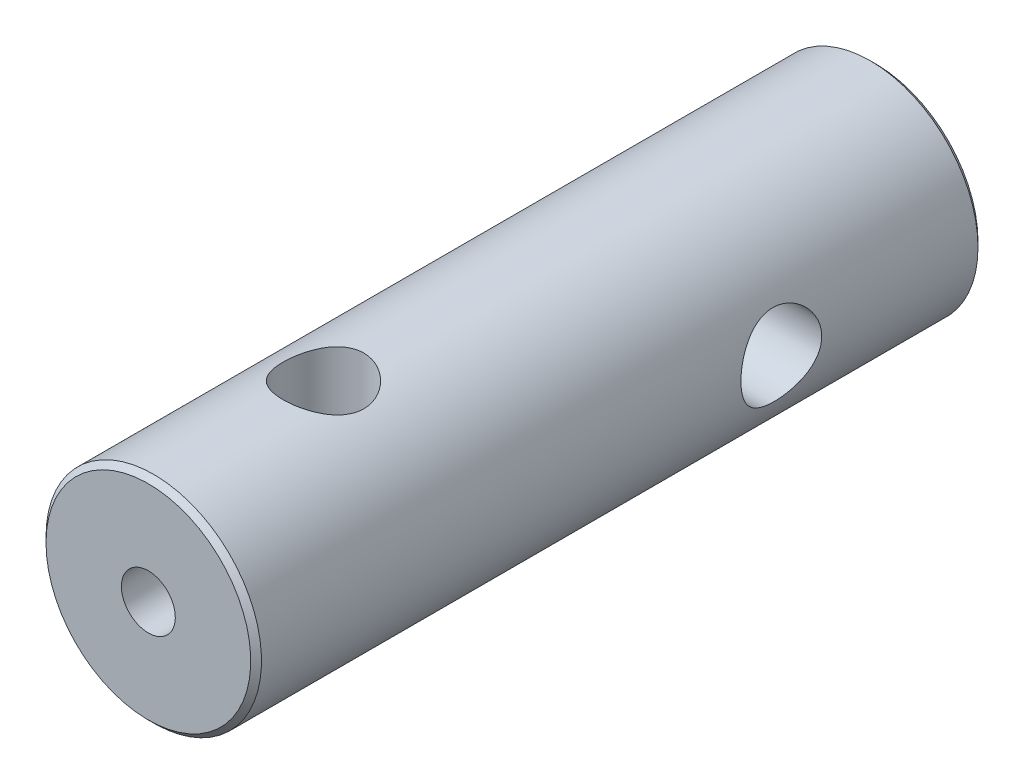
ISO-10303-21;
HEADER;
FILE_DESCRIPTION(('STEP AP214'),'2;1');
FILE_NAME('part.step','',(''),(''),'','','');
FILE_SCHEMA(('AUTOMOTIVE_DESIGN { 1 0 10303 214 1 1 1 1 }'));
ENDSEC;
DATA;
#1=APPLICATION_CONTEXT('core data for automotive mechanical design processes');
#2=APPLICATION_PROTOCOL_DEFINITION('international standard','automotive_design',2000,#1);
#3=PRODUCT_CONTEXT('',#1,'mechanical');
#4=PRODUCT('Part','Part','',(#3));
#5=PRODUCT_RELATED_PRODUCT_CATEGORY('part','',(#4));
#6=PRODUCT_DEFINITION_FORMATION('','',#4);
#7=PRODUCT_DEFINITION_CONTEXT('part definition',#1,'design');
#8=PRODUCT_DEFINITION('design','',#6,#7);
#9=PRODUCT_DEFINITION_SHAPE('','',#8);
#10=(LENGTH_UNIT() NAMED_UNIT(*) SI_UNIT(.MILLI.,.METRE.));
#11=(NAMED_UNIT(*) PLANE_ANGLE_UNIT() SI_UNIT($,.RADIAN.));
#12=(NAMED_UNIT(*) SI_UNIT($,.STERADIAN.) SOLID_ANGLE_UNIT());
#13=UNCERTAINTY_MEASURE_WITH_UNIT(LENGTH_MEASURE(1.E-05),#10,'distance_accuracy_value','');
#14=(GEOMETRIC_REPRESENTATION_CONTEXT(3) GLOBAL_UNCERTAINTY_ASSIGNED_CONTEXT((#13)) GLOBAL_UNIT_ASSIGNED_CONTEXT((#10,
#11,#12)) REPRESENTATION_CONTEXT('',''));
#15=CARTESIAN_POINT('',(0.,0.,0.));
#16=DIRECTION('',(0.,0.,1.));
#17=DIRECTION('',(1.,0.,0.));
#18=AXIS2_PLACEMENT_3D('',#15,#16,#17);
#19=CARTESIAN_POINT('',(0.,667.33201228622,-372.857743681072));
#20=DIRECTION('',(0.,0.,1.));
#21=DIRECTION('',(1.,0.,0.));
#22=AXIS2_PLACEMENT_3D('',#19,#20,#21);
#23=PLANE('',#22);
#24=CARTESIAN_POINT('',(0.,667.33201228622,-372.857743681072));
#25=DIRECTION('',(0.,0.,-1.));
#26=DIRECTION('',(0.,1.,0.));
#27=AXIS2_PLACEMENT_3D('',#24,#25,#26);
#28=CIRCLE('',#27,1.);
#29=CARTESIAN_POINT('',(0.,668.33201228622,-372.857743681072));
#30=VERTEX_POINT('',#29);
#31=EDGE_CURVE('E18',#30,#30,#28,.T.);
#32=ORIENTED_EDGE('',*,*,#31,.T.);
#33=EDGE_LOOP('',(#32));
#34=FACE_BOUND('',#33,.T.);
#35=CARTESIAN_POINT('',(0.,667.33201228622,-372.857743680925));
#36=DIRECTION('',(0.,0.,-1.));
#37=DIRECTION('',(-1.,0.,0.));
#38=AXIS2_PLACEMENT_3D('',#35,#36,#37);
#39=CIRCLE('',#38,3.80000000010827);
#40=CARTESIAN_POINT('',(-3.80000000010827,667.33201228622,-372.857743680925));
#41=VERTEX_POINT('',#40);
#42=EDGE_CURVE('E71',#41,#41,#39,.T.);
#43=ORIENTED_EDGE('',*,*,#42,.F.);
#44=EDGE_LOOP('',(#43));
#45=FACE_BOUND('',#44,.T.);
#46=ADVANCED_FACE('F15',(#34,#45),#23,.T.);
#47=CARTESIAN_POINT('',(0.,667.33201228622,-375.107743681072));
#48=DIRECTION('',(0.,0.,-1.));
#49=DIRECTION('',(0.,1.,0.));
#50=AXIS2_PLACEMENT_3D('',#47,#48,#49);
#51=CYLINDRICAL_SURFACE('',#50,1.);
#52=ORIENTED_EDGE('',*,*,#31,.F.);
#53=EDGE_LOOP('',(#52));
#54=FACE_BOUND('',#53,.T.);
#55=CARTESIAN_POINT('',(-1.,667.33201228622,-378.239709692321));
#56=CARTESIAN_POINT('',(-0.999992478924149,667.380747378736,-378.239697318764));
#57=CARTESIAN_POINT('',(-0.996399813993387,667.429565307739,-378.236456892599));
#58=CARTESIAN_POINT('',(-0.982310251669483,667.525503242356,-378.224101110688));
#59=CARTESIAN_POINT('',(-0.971789403236803,667.572616757524,-378.214965376808));
#60=CARTESIAN_POINT('',(-0.944676497496951,667.663385662361,-378.19245817535));
#61=CARTESIAN_POINT('',(-0.928147448411199,667.707071418175,-378.179130853804));
#62=CARTESIAN_POINT('',(-0.889662091659111,667.790960633344,-378.149817492051));
#63=CARTESIAN_POINT('',(-0.867706638554931,667.831164639668,-378.133831870609));
#64=CARTESIAN_POINT('',(-0.815013090372891,667.913833815842,-378.098013998009));
#65=CARTESIAN_POINT('',(-0.783439550678679,667.95567512472,-378.07797049909));
#66=CARTESIAN_POINT('',(-0.714098949741552,668.034010959446,-378.038021056078));
#67=CARTESIAN_POINT('',(-0.67632539829245,668.07049980569,-378.018115279154));
#68=CARTESIAN_POINT('',(-0.589078199073816,668.142334300967,-377.977299466836));
#69=CARTESIAN_POINT('',(-0.538702678853991,668.176753905246,-377.956659529814));
#70=CARTESIAN_POINT('',(-0.431234872880395,668.236333608755,-377.919951087639));
#71=CARTESIAN_POINT('',(-0.374150258400653,668.261504150132,-377.903877431858));
#72=CARTESIAN_POINT('',(-0.26162450355075,668.298790496302,-377.879744136549));
#73=CARTESIAN_POINT('',(-0.206717293255859,668.31205397479,-377.870987791986));
#74=CARTESIAN_POINT('',(-0.0948476523195606,668.329104536111,-377.859694950476));
#75=CARTESIAN_POINT('',(-0.0378879047001586,668.33290356515,-377.857150612697));
#76=CARTESIAN_POINT('',(0.0670734653959218,668.330926062375,-377.85846687172));
#77=CARTESIAN_POINT('',(0.115120199818957,668.326517771828,-377.861412349211));
#78=CARTESIAN_POINT('',(0.209619201295724,668.310966787864,-377.871702748896));
#79=CARTESIAN_POINT('',(0.256071347844395,668.299823586661,-377.879048002816));
#80=CARTESIAN_POINT('',(0.346038922439846,668.271414459553,-377.897483213266));
#81=CARTESIAN_POINT('',(0.389565222007163,668.254172883215,-377.908558269163));
#82=CARTESIAN_POINT('',(0.473104491149039,668.214235508389,-377.933638128428));
#83=CARTESIAN_POINT('',(0.51311681024609,668.19153870297,-377.947643472609));
#84=CARTESIAN_POINT('',(0.594143147155235,668.138022273653,-377.979653787795));
#85=CARTESIAN_POINT('',(0.634597629879143,668.106527123889,-377.997942504336));
#86=CARTESIAN_POINT('',(0.709995653793869,668.038061163122,-378.035741562724));
#87=CARTESIAN_POINT('',(0.744930781166684,668.00108215563,-378.055253707537));
#88=CARTESIAN_POINT('',(0.813854394700609,667.91603936934,-378.096989397655));
#89=CARTESIAN_POINT('',(0.846855925180306,667.867145901118,-378.119164172855));
#90=CARTESIAN_POINT('',(0.904165186008948,667.763276674577,-378.160358275152));
#91=CARTESIAN_POINT('',(0.928484325431816,667.708309023404,-378.179381725479));
#92=CARTESIAN_POINT('',(0.961768413970198,667.609345436805,-378.206515198472));
#93=CARTESIAN_POINT('',(0.973125714602644,667.566584592171,-378.216189511989));
#94=CARTESIAN_POINT('',(0.990093986914226,667.479236405063,-378.230869240515));
#95=CARTESIAN_POINT('',(0.995725376111317,667.434656146186,-378.235891239062));
#96=CARTESIAN_POINT('',(0.999444056465946,667.370586876566,-378.239213557707));
#97=CARTESIAN_POINT('',(1.00000297752657,667.351306072862,-378.239714590903));
#98=CARTESIAN_POINT('',(0.999992478924158,667.283277193704,-378.239697318765));
#99=CARTESIAN_POINT('',(0.996399813993387,667.234459264701,-378.2364568926));
#100=CARTESIAN_POINT('',(0.982310251669492,667.138521330084,-378.22410111069));
#101=CARTESIAN_POINT('',(0.971789403236837,667.091407814916,-378.21496537681));
#102=CARTESIAN_POINT('',(0.944676497497062,667.000638910079,-378.192458175352));
#103=CARTESIAN_POINT('',(0.928147448411366,666.956953154265,-378.179130853806));
#104=CARTESIAN_POINT('',(0.889662091659374,666.873063939096,-378.149817492053));
#105=CARTESIAN_POINT('',(0.867706638555214,666.832859932773,-378.13383187061));
#106=CARTESIAN_POINT('',(0.815013090373199,666.750190756598,-378.09801399801));
#107=CARTESIAN_POINT('',(0.783439550678989,666.708349447721,-378.077970499091));
#108=CARTESIAN_POINT('',(0.714098949741917,666.630013612994,-378.038021056079));
#109=CARTESIAN_POINT('',(0.676325398292865,666.59352476675,-378.018115279155));
#110=CARTESIAN_POINT('',(0.589078199074292,666.521690271474,-377.977299466837));
#111=CARTESIAN_POINT('',(0.538702678854473,666.487270667194,-377.956659529815));
#112=CARTESIAN_POINT('',(0.431234872880901,666.427690963685,-377.919951087639));
#113=CARTESIAN_POINT('',(0.374150258401177,666.402520422308,-377.903877431859));
#114=CARTESIAN_POINT('',(0.261624503551243,666.365234076138,-377.87974413655));
#115=CARTESIAN_POINT('',(0.206717293256305,666.35197059765,-377.870987791987));
#116=CARTESIAN_POINT('',(0.0948476523199132,666.334920036329,-377.859694950476));
#117=CARTESIAN_POINT('',(0.0378879047004664,666.33112100729,-377.857150612698));
#118=CARTESIAN_POINT('',(-0.0670734653956755,666.333098510065,-377.85846687172));
#119=CARTESIAN_POINT('',(-0.115120199818726,666.337506800612,-377.861412349211));
#120=CARTESIAN_POINT('',(-0.209619201295545,666.353057784576,-377.871702748896));
#121=CARTESIAN_POINT('',(-0.256071347844251,666.364200985779,-377.879048002815));
#122=CARTESIAN_POINT('',(-0.34603892243973,666.392610112887,-377.897483213265));
#123=CARTESIAN_POINT('',(-0.389565222007041,666.409851689225,-377.908558269162));
#124=CARTESIAN_POINT('',(-0.473104491148921,666.449789064051,-377.933638128427));
#125=CARTESIAN_POINT('',(-0.513116810245982,666.47248586947,-377.947643472608));
#126=CARTESIAN_POINT('',(-0.594143147155156,666.526002298787,-377.979653787794));
#127=CARTESIAN_POINT('',(-0.63459762987908,666.557497448551,-377.997942504335));
#128=CARTESIAN_POINT('',(-0.709995653793772,666.625963409318,-378.035741562723));
#129=CARTESIAN_POINT('',(-0.744930781166539,666.66294241681,-378.055253707536));
#130=CARTESIAN_POINT('',(-0.813854394700442,666.7479852031,-378.096989397654));
#131=CARTESIAN_POINT('',(-0.846855925180174,666.796878671322,-378.119164172853));
#132=CARTESIAN_POINT('',(-0.904165186008825,666.900747897863,-378.16035827515));
#133=CARTESIAN_POINT('',(-0.92848432543167,666.955715549035,-378.179381725477));
#134=CARTESIAN_POINT('',(-0.961768413970081,667.054679135634,-378.206515198471));
#135=CARTESIAN_POINT('',(-0.973125714602556,667.097439980268,-378.216189511988));
#136=CARTESIAN_POINT('',(-0.990093986914186,667.184788167376,-378.230869240513));
#137=CARTESIAN_POINT('',(-0.995725376111295,667.229368426254,-378.23589123906));
#138=CARTESIAN_POINT('',(-0.999444056465939,667.293437695874,-378.239213557705));
#139=CARTESIAN_POINT('',(-1.00000297752657,667.312718499577,-378.239714590902));
#140=CARTESIAN_POINT('',(-1.,667.33201228622,-378.239709692321));
#141=B_SPLINE_CURVE_WITH_KNOTS('',3,(#55,#56,#57,#58,#59,#60,#61,#62,#63,#64,#65,#66,#67,#68,
#69,#70,#71,#72,#73,#74,#75,#76,#77,#78,#79,#80,#81,#82,#83,#84,#85,#86,#87,#88,#89,#90,#91,#92,
#93,#94,#95,#96,#97,#98,#99,#100,#101,#102,#103,#104,#105,#106,#107,#108,#109,#110,#111,#112,
#113,#114,#115,#116,#117,#118,#119,#120,#121,#122,#123,#124,#125,#126,#127,#128,#129,#130,#131,
#132,#133,#134,#135,#136,#137,#138,#139,#140),.UNSPECIFIED.,.T.,.F.,(4,2,2,2,2,2,2,2,2,2,2,2,2,
2,2,2,2,2,2,2,2,2,2,2,2,2,2,2,2,2,2,2,2,2,2,2,2,2,2,2,2,2,4),(0.,0.14613086545061,
0.292769582718843,0.437912881300494,0.583033336941249,0.750767130901795,0.918677642639682,
1.1108362291228,1.30277719804278,1.47318756851124,1.64338273457219,1.7876975475012,
1.93202324258413,2.07577906166235,2.21956143572323,2.382241455931,2.54516712458717,
2.7333588566898,2.92130237775347,3.05664347079668,3.19150025248628,3.24935215333123,
3.39548301878179,3.54212173604979,3.68726503463108,3.83238549027197,4.00011928423252,
4.16802979597049,4.36018838245372,4.55212935137378,4.7225397218424,4.89273488790351,
5.03704970083257,5.18137539591557,5.32513121499375,5.46891358905454,5.63159360926226,
5.79451927791829,5.98271101002078,6.17065453108418,6.30599562412751,6.44085240581723,
6.49870430666243),.UNSPECIFIED.);
#142=CARTESIAN_POINT('',(-1.,667.33201228622,-378.239709692321));
#143=VERTEX_POINT('',#142);
#144=EDGE_CURVE('E66',#143,#143,#141,.T.);
#145=ORIENTED_EDGE('',*,*,#144,.T.);
#146=EDGE_LOOP('',(#145));
#147=FACE_BOUND('',#146,.T.);
#148=ADVANCED_FACE('F72',(#54,#147),#51,.F.);
#149=CARTESIAN_POINT('',(0.,667.33201228622,-399.857743681072));
#150=DIRECTION('',(0.,0.,1.));
#151=DIRECTION('',(1.,0.,0.));
#152=AXIS2_PLACEMENT_3D('',#149,#150,#151);
#153=PLANE('',#152);
#154=CARTESIAN_POINT('',(0.,667.33201228622,-399.857743681196));
#155=DIRECTION('',(0.,0.,1.));
#156=DIRECTION('',(1.,0.,0.));
#157=AXIS2_PLACEMENT_3D('',#154,#155,#156);
#158=CIRCLE('',#157,3.80000000008718);
#159=CARTESIAN_POINT('',(3.80000000008718,667.33201228622,-399.857743681196));
#160=VERTEX_POINT('',#159);
#161=EDGE_CURVE('E63',#160,#160,#158,.T.);
#162=ORIENTED_EDGE('',*,*,#161,.F.);
#163=EDGE_LOOP('',(#162));
#164=FACE_BOUND('',#163,.T.);
#165=ADVANCED_FACE('F85',(#164),#153,.F.);
#166=CARTESIAN_POINT('',(0.,667.33201228622,-373.057743681159));
#167=DIRECTION('',(0.,0.,-1.));
#168=DIRECTION('',(-1.,0.,0.));
#169=AXIS2_PLACEMENT_3D('',#166,#167,#168);
#170=CONICAL_SURFACE('',#169,3.99999999994438,0.785398162402688);
#171=CARTESIAN_POINT('',(0.,667.33201228622,-373.057743681072));
#172=DIRECTION('',(0.,0.,-1.));
#173=DIRECTION('',(-1.,0.,0.));
#174=AXIS2_PLACEMENT_3D('',#171,#172,#173);
#175=CIRCLE('',#174,4.);
#176=CARTESIAN_POINT('',(-3.99999999999999,667.33201228622,-373.057743681072));
#177=VERTEX_POINT('',#176);
#178=EDGE_CURVE('E36',#177,#177,#175,.T.);
#179=ORIENTED_EDGE('',*,*,#178,.F.);
#180=EDGE_LOOP('',(#179));
#181=FACE_BOUND('',#180,.T.);
#182=ORIENTED_EDGE('',*,*,#42,.T.);
#183=EDGE_LOOP('',(#182));
#184=FACE_BOUND('',#183,.T.);
#185=ADVANCED_FACE('F80',(#181,#184),#170,.T.);
#186=CARTESIAN_POINT('',(-9.094947E-13,667.332012286217,-379.357743681072));
#187=DIRECTION('',(0.,-1.,0.));
#188=DIRECTION('',(0.,0.,-1.));
#189=AXIS2_PLACEMENT_3D('',#186,#187,#188);
#190=CYLINDRICAL_SURFACE('',#189,1.5);
#191=CARTESIAN_POINT('',(-2.21356575496999E-13,671.33201228622,-377.857743681072));
#192=CARTESIAN_POINT('',(-0.0811637797182568,671.332009750952,-377.857746941328));
#193=CARTESIAN_POINT('',(-0.162363908439502,671.329517241132,-377.864358714796));
#194=CARTESIAN_POINT('',(-0.322386831218151,671.319807372418,-377.890551552126));
#195=CARTESIAN_POINT('',(-0.401207649668353,671.312586194259,-377.910143099681));
#196=CARTESIAN_POINT('',(-0.554065647957708,671.294199418451,-377.961499513184));
#197=CARTESIAN_POINT('',(-0.62811343638519,671.283042952026,-377.993236212549));
#198=CARTESIAN_POINT('',(-0.769812559913221,671.257897445169,-378.067858015635));
#199=CARTESIAN_POINT('',(-0.837463368371388,671.243908171818,-378.110744036154));
#200=CARTESIAN_POINT('',(-0.967340405524647,671.213876072696,-378.208351732447));
#201=CARTESIAN_POINT('',(-1.02925973068664,671.197775125311,-378.263463728823));
#202=CARTESIAN_POINT('',(-1.14323515279412,671.165617342721,-378.383143263679));
#203=CARTESIAN_POINT('',(-1.19528649107164,671.14956053246,-378.447715337648));
#204=CARTESIAN_POINT('',(-1.29000339800975,671.118629876676,-378.587491016599));
#205=CARTESIAN_POINT('',(-1.33223093134234,671.103825290632,-378.663008024908));
#206=CARTESIAN_POINT('',(-1.40321326562938,671.078001155179,-378.820673714844));
#207=CARTESIAN_POINT('',(-1.4319854345712,671.066976731325,-378.902813686094));
#208=CARTESIAN_POINT('',(-1.46885948096208,671.052592568057,-379.047362990244));
#209=CARTESIAN_POINT('',(-1.48050950764863,671.047945751861,-379.10876044862));
#210=CARTESIAN_POINT('',(-1.49608055228063,671.041704155795,-379.232679302283));
#211=CARTESIAN_POINT('',(-1.50000264542476,671.04010895135,-379.295200539995));
#212=CARTESIAN_POINT('',(-1.49999657652745,671.040114866527,-379.438681480001));
#213=CARTESIAN_POINT('',(-1.49342029679365,671.042794049564,-379.519655961034));
#214=CARTESIAN_POINT('',(-1.4673813199887,671.053165248769,-379.679208899218));
#215=CARTESIAN_POINT('',(-1.44790729939155,671.060861669709,-379.757785187414));
#216=CARTESIAN_POINT('',(-1.39689388750466,671.080268375327,-379.910123430543));
#217=CARTESIAN_POINT('',(-1.36538785775593,671.09196755218,-379.983898043079));
#218=CARTESIAN_POINT('',(-1.29131120222963,671.118046027888,-380.125128018151));
#219=CARTESIAN_POINT('',(-1.24873918346762,671.132425664095,-380.192582583664));
#220=CARTESIAN_POINT('',(-1.15147101765925,671.163046712428,-380.322628041889));
#221=CARTESIAN_POINT('',(-1.09631386593323,671.179342896646,-380.384861323394));
#222=CARTESIAN_POINT('',(-0.97640657045064,671.211507025864,-380.499457519922));
#223=CARTESIAN_POINT('',(-0.911652733558161,671.227374803207,-380.551816617311));
#224=CARTESIAN_POINT('',(-0.771665499721755,671.257547751026,-380.64690408349));
#225=CARTESIAN_POINT('',(-0.696148297553631,671.271780418964,-380.689239337299));
#226=CARTESIAN_POINT('',(-0.538476246683239,671.2964014335,-380.760421076508));
#227=CARTESIAN_POINT('',(-0.456329605955194,671.306794447671,-380.789283950573));
#228=CARTESIAN_POINT('',(-0.311553638319177,671.320326642251,-380.826366188855));
#229=CARTESIAN_POINT('',(-0.249917625399308,671.324683044206,-380.838105889297));
#230=CARTESIAN_POINT('',(-0.125528244784168,671.330526696843,-380.853795489547));
#231=CARTESIAN_POINT('',(-0.0627749944400534,671.332014247087,-380.857746202672));
#232=CARTESIAN_POINT('',(0.0811637797174864,671.332009750952,-380.857740420816));
#233=CARTESIAN_POINT('',(0.16236390843873,671.329517241132,-380.851128647348));
#234=CARTESIAN_POINT('',(0.322386831217359,671.319807372418,-380.824935810018));
#235=CARTESIAN_POINT('',(0.401207649667544,671.312586194259,-380.805344262462));
#236=CARTESIAN_POINT('',(0.554065647956855,671.294199418451,-380.75398784896));
#237=CARTESIAN_POINT('',(0.628113436384313,671.283042952026,-380.722251149594));
#238=CARTESIAN_POINT('',(0.769812559912305,671.257897445169,-380.647629346508));
#239=CARTESIAN_POINT('',(0.837463368370457,671.243908171818,-380.604743325989));
#240=CARTESIAN_POINT('',(0.967340405523673,671.213876072696,-380.507135629696));
#241=CARTESIAN_POINT('',(1.02925973068565,671.197775125312,-380.45202363332));
#242=CARTESIAN_POINT('',(1.14323515279304,671.165617342722,-380.332344098464));
#243=CARTESIAN_POINT('',(1.19528649107052,671.14956053246,-380.267772024495));
#244=CARTESIAN_POINT('',(1.29000339800851,671.118629876676,-380.127996345544));
#245=CARTESIAN_POINT('',(1.33223093134103,671.103825290633,-380.052479337236));
#246=CARTESIAN_POINT('',(1.40321326562795,671.078001155179,-379.894813647299));
#247=CARTESIAN_POINT('',(1.43198543456972,671.066976731326,-379.812673676049));
#248=CARTESIAN_POINT('',(1.46885948096045,671.052592568057,-379.668124371899));
#249=CARTESIAN_POINT('',(1.48050950764693,671.047945751862,-379.606726913523));
#250=CARTESIAN_POINT('',(1.49608055227884,671.041704155796,-379.482808059861));
#251=CARTESIAN_POINT('',(1.50000264542294,671.040108951351,-379.420286822149));
#252=CARTESIAN_POINT('',(1.49999657652564,671.040114866528,-379.276805882143));
#253=CARTESIAN_POINT('',(1.49342029679184,671.042794049565,-379.195831401109));
#254=CARTESIAN_POINT('',(1.46738131998687,671.05316524877,-379.036278462926));
#255=CARTESIAN_POINT('',(1.44790729938971,671.060861669709,-378.95770217473));
#256=CARTESIAN_POINT('',(1.39689388750282,671.080268375328,-378.805363931601));
#257=CARTESIAN_POINT('',(1.36538785775408,671.091967552181,-378.731589319065));
#258=CARTESIAN_POINT('',(1.29131120222776,671.118046027889,-378.590359343993));
#259=CARTESIAN_POINT('',(1.24873918346573,671.132425664095,-378.522904778479));
#260=CARTESIAN_POINT('',(1.15147101765735,671.163046712429,-378.392859320255));
#261=CARTESIAN_POINT('',(1.09631386593133,671.179342896647,-378.33062603875));
#262=CARTESIAN_POINT('',(0.976406570448718,671.211507025865,-378.216029842222));
#263=CARTESIAN_POINT('',(0.911652733556207,671.227374803207,-378.163670744833));
#264=CARTESIAN_POINT('',(0.771665499719779,671.257547751027,-378.068583278654));
#265=CARTESIAN_POINT('',(0.696148297551672,671.271780418965,-378.026248024845));
#266=CARTESIAN_POINT('',(0.538476246681285,671.2964014335,-377.955066285636));
#267=CARTESIAN_POINT('',(0.456329605953229,671.306794447671,-377.926203411571));
#268=CARTESIAN_POINT('',(0.311553638317394,671.320326642251,-377.889121173289));
#269=CARTESIAN_POINT('',(0.249917625397722,671.324683044206,-377.877381472847));
#270=CARTESIAN_POINT('',(0.125528244782984,671.330526696843,-377.861691872597));
#271=CARTESIAN_POINT('',(0.0627749944390763,671.332014247087,-377.857741159473));
#272=CARTESIAN_POINT('',(-2.21356575496999E-13,671.33201228622,-377.857743681072));
#273=B_SPLINE_CURVE_WITH_KNOTS('',3,(#191,#192,#193,#194,#195,#196,#197,#198,#199,#200,#201,
#202,#203,#204,#205,#206,#207,#208,#209,#210,#211,#212,#213,#214,#215,#216,#217,#218,#219,#220,
#221,#222,#223,#224,#225,#226,#227,#228,#229,#230,#231,#232,#233,#234,#235,#236,#237,#238,#239,
#240,#241,#242,#243,#244,#245,#246,#247,#248,#249,#250,#251,#252,#253,#254,#255,#256,#257,#258,
#259,#260,#261,#262,#263,#264,#265,#266,#267,#268,#269,#270,#271,#272),.UNSPECIFIED.,.T.,.F.,(4,
2,2,2,2,2,2,2,2,2,2,2,2,2,2,2,2,2,2,2,2,2,2,2,2,2,2,2,2,2,2,2,2,2,2,2,2,2,2,2,4),(0.,
0.243253922382214,0.486704559569273,0.729593983648455,0.972503386639462,1.22471406308005,
1.4770460561466,1.73908397705404,2.00078272326119,2.18825346503835,2.37569812189512,
2.6182724103891,2.86105994893169,3.10317913363637,3.34532881102654,3.5984227882753,
3.85161441896644,4.11351312959331,4.37509241417904,4.5632534193952,4.75139477601979,
4.99464869840201,5.23809933558906,5.48098875966822,5.72389816265928,5.97610883909989,
6.22844083216639,6.49047875307382,6.75217749928095,6.93964824105757,7.12709289791378,
7.36966718640786,7.6124547249504,7.85457390965514,8.09672358704531,8.34981756429404,
8.60300919498524,8.86490790561204,9.12648719019776,9.31464819541333,9.50278955203731),.UNSPECIFIED.);
#274=CARTESIAN_POINT('',(-2.21356575496999E-13,671.33201228622,-377.857743681072));
#275=VERTEX_POINT('',#274);
#276=EDGE_CURVE('E27',#275,#275,#273,.T.);
#277=ORIENTED_EDGE('',*,*,#276,.F.);
#278=EDGE_LOOP('',(#277));
#279=FACE_BOUND('',#278,.T.);
#280=CARTESIAN_POINT('',(-6.33339743692134E-13,663.33201228622,-380.857743681072));
#281=CARTESIAN_POINT('',(-0.0811637797186762,663.332014821488,-380.857740420816));
#282=CARTESIAN_POINT('',(-0.162363908439927,663.334507331308,-380.851128647348));
#283=CARTESIAN_POINT('',(-0.322386831218573,663.344217200022,-380.824935810018));
#284=CARTESIAN_POINT('',(-0.401207649668767,663.351438378181,-380.805344262462));
#285=CARTESIAN_POINT('',(-0.554065647958123,663.369825153989,-380.75398784896));
#286=CARTESIAN_POINT('',(-0.628113436385615,663.380981620414,-380.722251149595));
#287=CARTESIAN_POINT('',(-0.769812559913628,663.406127127271,-380.647629346509));
#288=CARTESIAN_POINT('',(-0.837463368371768,663.420116400622,-380.60474332599));
#289=CARTESIAN_POINT('',(-0.967340405524998,663.450148499744,-380.507135629696));
#290=CARTESIAN_POINT('',(-1.02925973068699,663.466249447129,-380.452023633321));
#291=CARTESIAN_POINT('',(-1.14323515279444,663.498407229719,-380.332344098464));
#292=CARTESIAN_POINT('',(-1.19528649107193,663.51446403998,-380.267772024495));
#293=CARTESIAN_POINT('',(-1.29000339800999,663.545394695764,-380.127996345545));
#294=CARTESIAN_POINT('',(-1.33223093134256,663.560199281808,-380.052479337236));
#295=CARTESIAN_POINT('',(-1.40321326562955,663.586023417261,-379.8948136473));
#296=CARTESIAN_POINT('',(-1.43198543457135,663.597047841115,-379.812673676049));
#297=CARTESIAN_POINT('',(-1.46885948096216,663.611432004383,-379.6681243719));
#298=CARTESIAN_POINT('',(-1.48050950764868,663.616078820579,-379.606726913523));
#299=CARTESIAN_POINT('',(-1.49608055228064,663.622320416645,-379.482808059861));
#300=CARTESIAN_POINT('',(-1.50000264542476,663.62391562109,-379.420286822149));
#301=CARTESIAN_POINT('',(-1.49999657652745,663.623909705913,-379.276805882143));
#302=CARTESIAN_POINT('',(-1.49342029679365,663.621230522876,-379.19583140111));
#303=CARTESIAN_POINT('',(-1.4673813199887,663.610859323671,-379.036278462926));
#304=CARTESIAN_POINT('',(-1.44790729939155,663.603162902731,-378.95770217473));
#305=CARTESIAN_POINT('',(-1.39689388750466,663.583756197113,-378.805363931601));
#306=CARTESIAN_POINT('',(-1.36538785775593,663.57205702026,-378.731589319065));
#307=CARTESIAN_POINT('',(-1.29131120222963,663.545978544552,-378.590359343993));
#308=CARTESIAN_POINT('',(-1.24873918346762,663.531598908345,-378.52290477848));
#309=CARTESIAN_POINT('',(-1.15147101765926,663.500977860012,-378.392859320255));
#310=CARTESIAN_POINT('',(-1.09631386593324,663.484681675794,-378.33062603875));
#311=CARTESIAN_POINT('',(-0.976406570450659,663.452517546576,-378.216029842222));
#312=CARTESIAN_POINT('',(-0.911652733558172,663.436649769233,-378.163670744833));
#313=CARTESIAN_POINT('',(-0.771665499721783,663.406476821414,-378.068583278654));
#314=CARTESIAN_POINT('',(-0.696148297553688,663.392244153476,-378.026248024845));
#315=CARTESIAN_POINT('',(-0.538476246683299,663.36762313894,-377.955066285636));
#316=CARTESIAN_POINT('',(-0.456329605955224,663.357230124769,-377.926203411571));
#317=CARTESIAN_POINT('',(-0.311553638319119,663.343697930189,-377.889121173289));
#318=CARTESIAN_POINT('',(-0.249917625399191,663.339341528234,-377.877381472847));
#319=CARTESIAN_POINT('',(-0.125528244783938,663.333497875597,-377.861691872597));
#320=CARTESIAN_POINT('',(-0.0627749944397701,663.332010325352,-377.857741159472));
#321=CARTESIAN_POINT('',(0.081163779717823,663.332014821488,-377.857746941328));
#322=CARTESIAN_POINT('',(0.162363908439065,663.334507331308,-377.864358714796));
#323=CARTESIAN_POINT('',(0.322386831217695,663.344217200022,-377.890551552126));
#324=CARTESIAN_POINT('',(0.401207649667881,663.351438378181,-377.910143099682));
#325=CARTESIAN_POINT('',(0.554065647957204,663.369825153989,-377.961499513184));
#326=CARTESIAN_POINT('',(0.628113436384669,663.380981620414,-377.99323621255));
#327=CARTESIAN_POINT('',(0.769812559912639,663.406127127271,-378.067858015636));
#328=CARTESIAN_POINT('',(0.837463368370761,663.420116400622,-378.110744036155));
#329=CARTESIAN_POINT('',(0.967340405523927,663.450148499744,-378.208351732448));
#330=CARTESIAN_POINT('',(1.02925973068588,663.466249447128,-378.263463728824));
#331=CARTESIAN_POINT('',(1.14323515279325,663.498407229718,-378.38314326368));
#332=CARTESIAN_POINT('',(1.19528649107072,663.51446403998,-378.447715337649));
#333=CARTESIAN_POINT('',(1.2900033980087,663.545394695764,-378.5874910166));
#334=CARTESIAN_POINT('',(1.3322309313412,663.560199281807,-378.663008024909));
#335=CARTESIAN_POINT('',(1.40321326562808,663.58602341726,-378.820673714845));
#336=CARTESIAN_POINT('',(1.43198543456983,663.597047841114,-378.902813686096));
#337=CARTESIAN_POINT('',(1.46885948096051,663.611432004383,-379.047362990245));
#338=CARTESIAN_POINT('',(1.48050950764697,663.616078820578,-379.108760448621));
#339=CARTESIAN_POINT('',(1.49608055227884,663.622320416644,-379.232679302284));
#340=CARTESIAN_POINT('',(1.50000264542294,663.623915621089,-379.295200539995));
#341=CARTESIAN_POINT('',(1.49999657652564,663.623909705912,-379.438681480001));
#342=CARTESIAN_POINT('',(1.49342029679184,663.621230522875,-379.519655961035));
#343=CARTESIAN_POINT('',(1.46738131998687,663.61085932367,-379.679208899218));
#344=CARTESIAN_POINT('',(1.44790729938971,663.603162902731,-379.757785187414));
#345=CARTESIAN_POINT('',(1.39689388750282,663.583756197112,-379.910123430543));
#346=CARTESIAN_POINT('',(1.36538785775408,663.572057020259,-379.983898043079));
#347=CARTESIAN_POINT('',(1.29131120222776,663.545978544551,-380.125128018151));
#348=CARTESIAN_POINT('',(1.24873918346573,663.531598908345,-380.192582583664));
#349=CARTESIAN_POINT('',(1.15147101765734,663.500977860011,-380.322628041889));
#350=CARTESIAN_POINT('',(1.09631386593131,663.484681675793,-380.384861323394));
#351=CARTESIAN_POINT('',(0.976406570448695,663.452517546575,-380.499457519922));
#352=CARTESIAN_POINT('',(0.911652733556198,663.436649769233,-380.551816617311));
#353=CARTESIAN_POINT('',(0.771665499719783,663.406476821413,-380.64690408349));
#354=CARTESIAN_POINT('',(0.696148297551673,663.392244153475,-380.689239337299));
#355=CARTESIAN_POINT('',(0.538476246681284,663.36762313894,-380.760421076508));
#356=CARTESIAN_POINT('',(0.456329605953228,663.357230124768,-380.789283950573));
#357=CARTESIAN_POINT('',(0.311553638317326,663.343697930189,-380.826366188855));
#358=CARTESIAN_POINT('',(0.249917625397585,663.339341528234,-380.838105889297));
#359=CARTESIAN_POINT('',(0.125528244782709,663.333497875597,-380.853795489547));
#360=CARTESIAN_POINT('',(0.0627749944387324,663.332010325352,-380.857746202671));
#361=CARTESIAN_POINT('',(-6.33339743692134E-13,663.33201228622,-380.857743681072));
#362=B_SPLINE_CURVE_WITH_KNOTS('',3,(#280,#281,#282,#283,#284,#285,#286,#287,#288,#289,#290,
#291,#292,#293,#294,#295,#296,#297,#298,#299,#300,#301,#302,#303,#304,#305,#306,#307,#308,#309,
#310,#311,#312,#313,#314,#315,#316,#317,#318,#319,#320,#321,#322,#323,#324,#325,#326,#327,#328,
#329,#330,#331,#332,#333,#334,#335,#336,#337,#338,#339,#340,#341,#342,#343,#344,#345,#346,#347,
#348,#349,#350,#351,#352,#353,#354,#355,#356,#357,#358,#359,#360,#361),.UNSPECIFIED.,.T.,.F.,(4,
2,2,2,2,2,2,2,2,2,2,2,2,2,2,2,2,2,2,2,2,2,2,2,2,2,2,2,2,2,2,2,2,2,2,2,2,2,2,2,4),(0.,
0.243253922382231,0.486704559569304,0.729593983648515,0.972503386639524,1.22471406308013,
1.47704605614668,1.73908397705413,2.00078272326125,2.18825346503817,2.37569812189472,
2.6182724103887,2.86105994893129,3.10317913363597,3.34532881102614,3.59842278827486,
3.85161441896604,4.11351312959281,4.37509241417864,4.56325341939499,4.75139477601973,
4.99464869840195,5.23809933558902,5.48098875966823,5.72389816265926,5.97610883909982,
6.22844083216633,6.49047875307383,6.75217749928095,6.93964824105734,7.12709289791338,
7.36966718640747,7.61245472495,7.85457390965474,8.09672358704491,8.34981756429366,
8.60300919498485,8.86490790561164,9.12648719019736,9.31464819541314,9.50278955203732),.UNSPECIFIED.);
#363=CARTESIAN_POINT('',(-6.33339743692134E-13,663.33201228622,-380.857743681072));
#364=VERTEX_POINT('',#363);
#365=EDGE_CURVE('E51',#364,#364,#362,.T.);
#366=ORIENTED_EDGE('',*,*,#365,.F.);
#367=EDGE_LOOP('',(#366));
#368=FACE_BOUND('',#367,.T.);
#369=ORIENTED_EDGE('',*,*,#144,.F.);
#370=EDGE_LOOP('',(#369));
#371=FACE_BOUND('',#370,.T.);
#372=ADVANCED_FACE('F75',(#279,#368,#371),#190,.F.);
#373=CARTESIAN_POINT('',(0.,667.33201228622,-399.657743680848));
#374=DIRECTION('',(0.,0.,1.));
#375=DIRECTION('',(1.,0.,0.));
#376=AXIS2_PLACEMENT_3D('',#373,#374,#375);
#377=CONICAL_SURFACE('',#376,4.00000000009382,0.785398162544797);
#378=ORIENTED_EDGE('',*,*,#161,.T.);
#379=EDGE_LOOP('',(#378));
#380=FACE_BOUND('',#379,.T.);
#381=CARTESIAN_POINT('',(0.,667.33201228622,-399.657743681072));
#382=DIRECTION('',(0.,0.,-1.));
#383=DIRECTION('',(-1.,0.,0.));
#384=AXIS2_PLACEMENT_3D('',#381,#382,#383);
#385=CIRCLE('',#384,4.);
#386=CARTESIAN_POINT('',(-4.,667.33201228622,-399.657743681072));
#387=VERTEX_POINT('',#386);
#388=EDGE_CURVE('E22',#387,#387,#385,.F.);
#389=ORIENTED_EDGE('',*,*,#388,.F.);
#390=EDGE_LOOP('',(#389));
#391=FACE_BOUND('',#390,.T.);
#392=ADVANCED_FACE('F79',(#380,#391),#377,.T.);
#393=CARTESIAN_POINT('',(0.,667.387388585829,-392.357743681072));
#394=DIRECTION('',(-1.,0.,0.));
#395=DIRECTION('',(0.,0.,1.));
#396=AXIS2_PLACEMENT_3D('',#393,#394,#395);
#397=CYLINDRICAL_SURFACE('',#396,1.5);
#398=CARTESIAN_POINT('',(3.68521431759604,668.887388585829,-392.357743681072));
#399=CARTESIAN_POINT('',(3.68521780515984,668.887385055215,-392.438382317474));
#400=CARTESIAN_POINT('',(3.68799219251679,668.880856594961,-392.519058711905));
#401=CARTESIAN_POINT('',(3.69873655501338,668.855014066292,-392.678014952872));
#402=CARTESIAN_POINT('',(3.70671125321431,668.835688374841,-392.756292553029));
#403=CARTESIAN_POINT('',(3.72683567959583,668.785087800711,-392.908030788601));
#404=CARTESIAN_POINT('',(3.73897312408634,668.753848044755,-392.981504847537));
#405=CARTESIAN_POINT('',(3.7660730919407,668.680425847498,-393.122174574239));
#406=CARTESIAN_POINT('',(3.781035987503,668.638241964244,-393.189369413093));
#407=CARTESIAN_POINT('',(3.81303961722771,668.541735898768,-393.319166795829));
#408=CARTESIAN_POINT('',(3.83014583753369,668.486925421714,-393.381390188689));
#409=CARTESIAN_POINT('',(3.8640746541017,668.367754537686,-393.496041759948));
#410=CARTESIAN_POINT('',(3.88089712995578,668.30339018466,-393.548465870622));
#411=CARTESIAN_POINT('',(3.91323341815826,668.163836087574,-393.644041225552));
#412=CARTESIAN_POINT('',(3.92866873888702,668.088317967769,-393.686741590251));
#413=CARTESIAN_POINT('',(3.95577494261898,667.930530542769,-393.758633415099));
#414=CARTESIAN_POINT('',(3.96745031213187,667.84826943177,-393.787840993553));
#415=CARTESIAN_POINT('',(3.98326738481001,667.702670907106,-393.825600495359));
#416=CARTESIAN_POINT('',(3.98859751987681,667.640341603747,-393.837622348518));
#417=CARTESIAN_POINT('',(3.99633286174678,667.514485170368,-393.853694696251));
#418=CARTESIAN_POINT('',(3.9987384193678,667.450958184943,-393.85774614695));
#419=CARTESIAN_POINT('',(4.00073478464459,667.30645627927,-393.857740541691));
#420=CARTESIAN_POINT('',(3.99937734876393,667.225454901984,-393.851166580382));
#421=CARTESIAN_POINT('',(3.99193089533875,667.065752596002,-393.825091016821));
#422=CARTESIAN_POINT('',(3.98583829086253,666.987053458189,-393.805579615991));
#423=CARTESIAN_POINT('',(3.96966349382374,666.83436125994,-393.754393650443));
#424=CARTESIAN_POINT('',(3.95959000286837,666.760358341046,-393.722745618975));
#425=CARTESIAN_POINT('',(3.93654037595556,666.618705126034,-393.648298795054));
#426=CARTESIAN_POINT('',(3.92356393243037,666.551055504126,-393.605498820972));
#427=CARTESIAN_POINT('',(3.89553171198282,666.421298565804,-393.508171031167));
#428=CARTESIAN_POINT('',(3.88041772158937,666.359480041574,-393.453275159628));
#429=CARTESIAN_POINT('',(3.85010763428004,666.245666747575,-393.334096370419));
#430=CARTESIAN_POINT('',(3.83491151328699,666.193675039498,-393.269810538187));
#431=CARTESIAN_POINT('',(3.80554996340815,666.098988642645,-393.130646477151));
#432=CARTESIAN_POINT('',(3.7914478526868,666.056735664442,-393.055452903817));
#433=CARTESIAN_POINT('',(3.76677085402245,665.985585266971,-392.89845397514));
#434=CARTESIAN_POINT('',(3.75619474835236,665.956683235542,-392.816650914574));
#435=CARTESIAN_POINT('',(3.74033481017102,665.914127263478,-392.651822073676));
#436=CARTESIAN_POINT('',(3.73487464718281,665.899963257264,-392.568945568217));
#437=CARTESIAN_POINT('',(3.72937409622703,665.885695339089,-392.401826237886));
#438=CARTESIAN_POINT('',(3.72933160318964,665.88558596611,-392.31758395642));
#439=CARTESIAN_POINT('',(3.73451355735983,665.899026073997,-392.15514052307));
#440=CARTESIAN_POINT('',(3.73944356742547,665.911811982979,-392.076865008193));
#441=CARTESIAN_POINT('',(3.75350498515312,665.949406495132,-391.923656802384));
#442=CARTESIAN_POINT('',(3.76263700437317,665.97421684836,-391.848724599777));
#443=CARTESIAN_POINT('',(3.78421524221456,666.035561832146,-391.702810337222));
#444=CARTESIAN_POINT('',(3.79671572334749,666.072290635069,-391.63191830043));
#445=CARTESIAN_POINT('',(3.82356506630666,666.156303649773,-391.497078371803));
#446=CARTESIAN_POINT('',(3.83791445614389,666.203590879664,-391.433132473297));
#447=CARTESIAN_POINT('',(3.86788041123265,666.310843968885,-391.309824392257));
#448=CARTESIAN_POINT('',(3.8835203751668,666.371414226071,-391.250992382504));
#449=CARTESIAN_POINT('',(3.91346361815254,666.501789136607,-391.144146503949));
#450=CARTESIAN_POINT('',(3.92776632688591,666.571597699567,-391.09613723867));
#451=CARTESIAN_POINT('',(3.95356698212545,666.719624614219,-391.011848240147));
#452=CARTESIAN_POINT('',(3.96502849744142,666.797935354168,-390.975719097629));
#453=CARTESIAN_POINT('',(3.98349036407712,666.959972195477,-390.917362150915));
#454=CARTESIAN_POINT('',(3.99049963195654,667.043687100865,-390.895106563688));
#455=CARTESIAN_POINT('',(3.9970038603215,667.171386476307,-390.872743169705));
#456=CARTESIAN_POINT('',(3.99850287879629,667.214373675513,-390.867125257466));
#457=CARTESIAN_POINT('',(4.00011034335692,667.300699487091,-390.859624272801));
#458=CARTESIAN_POINT('',(4.00021880164537,667.344038096376,-390.857741167601));
#459=CARTESIAN_POINT('',(3.99848666135704,667.468742524233,-390.857748397991));
#460=CARTESIAN_POINT('',(3.99485405827331,667.550138302645,-390.86439395502));
#461=CARTESIAN_POINT('',(3.98286720027183,667.710513117982,-390.890700482585));
#462=CARTESIAN_POINT('',(3.97450558399016,667.789488184195,-390.910381753208));
#463=CARTESIAN_POINT('',(3.95388219300814,667.942556657266,-390.961931561799));
#464=CARTESIAN_POINT('',(3.94163108443656,668.016662753249,-390.993766817768));
#465=CARTESIAN_POINT('',(3.91436647691527,668.158421816309,-391.068582931906));
#466=CARTESIAN_POINT('',(3.89935318077787,668.226075256615,-391.111562971869));
#467=CARTESIAN_POINT('',(3.86729127929488,668.356084113693,-391.209476634654));
#468=CARTESIAN_POINT('',(3.85018481349785,668.418113254134,-391.2648244591));
#469=CARTESIAN_POINT('',(3.81614563646063,668.532257189633,-391.385040982801));
#470=CARTESIAN_POINT('',(3.79921302139945,668.58436674992,-391.449914677248));
#471=CARTESIAN_POINT('',(3.76669661733577,668.679083733569,-391.590307106626));
#472=CARTESIAN_POINT('',(3.75118693512394,668.721263011047,-391.666133170249));
#473=CARTESIAN_POINT('',(3.72420297540337,668.792067730083,-391.824476891569));
#474=CARTESIAN_POINT('',(3.71272312447888,668.820711910355,-391.906985111528));
#475=CARTESIAN_POINT('',(3.69791961538963,668.857019107955,-392.051193756556));
#476=CARTESIAN_POINT('',(3.69318840727233,668.86838030563,-392.111841941362));
#477=CARTESIAN_POINT('',(3.68683464358203,668.883565861221,-392.234234031649));
#478=CARTESIAN_POINT('',(3.68521164626465,668.887391290135,-392.295977780167));
#479=CARTESIAN_POINT('',(3.68521431759604,668.887388585829,-392.357743681072));
#480=B_SPLINE_CURVE_WITH_KNOTS('',3,(#398,#399,#400,#401,#402,#403,#404,#405,#406,#407,#408,
#409,#410,#411,#412,#413,#414,#415,#416,#417,#418,#419,#420,#421,#422,#423,#424,#425,#426,#427,
#428,#429,#430,#431,#432,#433,#434,#435,#436,#437,#438,#439,#440,#441,#442,#443,#444,#445,#446,
#447,#448,#449,#450,#451,#452,#453,#454,#455,#456,#457,#458,#459,#460,#461,#462,#463,#464,#465,
#466,#467,#468,#469,#470,#471,#472,#473,#474,#475,#476,#477,#478,#479),.UNSPECIFIED.,.T.,.F.,(4,
2,2,2,2,2,2,2,2,2,2,2,2,2,2,2,2,2,2,2,2,2,2,2,2,2,2,2,2,2,2,2,2,2,2,2,2,2,2,2,4),(0.,
0.241678566525642,0.483576938271586,0.724767556799881,0.965989969713002,1.21887615345391,
1.47186707934513,1.73490403548036,1.99762595335558,2.18818797090137,2.37872712731381,
2.62130807218362,2.86407295356007,3.10631009748957,3.3485729186034,3.59959427891965,
3.8506937202882,4.1115869318696,4.3723899488479,4.62383195208012,4.87517625563802,
5.11246334519862,5.34978498031587,5.59118537542423,5.83265486304192,6.08909882327139,
6.34565165861596,6.60534129344003,6.864509191742,6.99448455649087,7.12445878066251,
7.36837563513857,7.61267322917225,7.85630659161182,8.09992207252233,8.35342065034229,
8.60705263605046,8.87016813348987,9.13291828465226,9.31806050726052,9.503176415177),.UNSPECIFIED.);
#481=CARTESIAN_POINT('',(3.68521431759604,668.887388585829,-392.357743681072));
#482=VERTEX_POINT('',#481);
#483=EDGE_CURVE('E57',#482,#482,#480,.T.);
#484=ORIENTED_EDGE('',*,*,#483,.F.);
#485=EDGE_LOOP('',(#484));
#486=FACE_BOUND('',#485,.T.);
#487=CARTESIAN_POINT('',(-3.68521431759603,668.887388585829,-392.357743681072));
#488=CARTESIAN_POINT('',(-3.68521780515984,668.887385055215,-392.27710504467));
#489=CARTESIAN_POINT('',(-3.68799219251679,668.880856594961,-392.196428650239));
#490=CARTESIAN_POINT('',(-3.69873655501337,668.855014066292,-392.037472409272));
#491=CARTESIAN_POINT('',(-3.7067112532143,668.835688374841,-391.959194809115));
#492=CARTESIAN_POINT('',(-3.72683567959582,668.785087800711,-391.807456573543));
#493=CARTESIAN_POINT('',(-3.73897312408634,668.753848044755,-391.733982514607));
#494=CARTESIAN_POINT('',(-3.7660730919407,668.680425847498,-391.593312787905));
#495=CARTESIAN_POINT('',(-3.78103598750299,668.638241964244,-391.526117949051));
#496=CARTESIAN_POINT('',(-3.8130396172277,668.541735898768,-391.396320566315));
#497=CARTESIAN_POINT('',(-3.83014583753368,668.486925421714,-391.334097173455));
#498=CARTESIAN_POINT('',(-3.8640746541017,668.367754537686,-391.219445602196));
#499=CARTESIAN_POINT('',(-3.88089712995577,668.30339018466,-391.167021491522));
#500=CARTESIAN_POINT('',(-3.91323341815825,668.163836087574,-391.071446136592));
#501=CARTESIAN_POINT('',(-3.92866873888702,668.088317967769,-391.028745771893));
#502=CARTESIAN_POINT('',(-3.95577494261897,667.930530542769,-390.956853947045));
#503=CARTESIAN_POINT('',(-3.96745031213187,667.84826943177,-390.927646368591));
#504=CARTESIAN_POINT('',(-3.98326738481,667.702670907106,-390.889886866785));
#505=CARTESIAN_POINT('',(-3.9885975198768,667.640341603747,-390.877865013626));
#506=CARTESIAN_POINT('',(-3.99633286174677,667.514485170368,-390.861792665893));
#507=CARTESIAN_POINT('',(-3.99873841936779,667.450958184943,-390.857741215194));
#508=CARTESIAN_POINT('',(-4.00073478464459,667.30645627927,-390.857746820453));
#509=CARTESIAN_POINT('',(-3.99937734876392,667.225454901984,-390.864320781762));
#510=CARTESIAN_POINT('',(-3.99193089533874,667.065752596002,-390.890396345323));
#511=CARTESIAN_POINT('',(-3.98583829086252,666.987053458189,-390.909907746153));
#512=CARTESIAN_POINT('',(-3.96966349382373,666.83436125994,-390.961093711701));
#513=CARTESIAN_POINT('',(-3.95959000286836,666.760358341046,-390.992741743169));
#514=CARTESIAN_POINT('',(-3.93654037595556,666.618705126034,-391.067188567091));
#515=CARTESIAN_POINT('',(-3.92356393243037,666.551055504126,-391.109988541172));
#516=CARTESIAN_POINT('',(-3.89553171198281,666.421298565804,-391.207316330978));
#517=CARTESIAN_POINT('',(-3.88041772158936,666.359480041574,-391.262212202516));
#518=CARTESIAN_POINT('',(-3.85010763428004,666.245666747575,-391.381390991725));
#519=CARTESIAN_POINT('',(-3.83491151328698,666.193675039498,-391.445676823957));
#520=CARTESIAN_POINT('',(-3.80554996340814,666.098988642645,-391.584840884993));
#521=CARTESIAN_POINT('',(-3.79144785268679,666.056735664442,-391.660034458327));
#522=CARTESIAN_POINT('',(-3.76677085402244,665.985585266971,-391.817033387004));
#523=CARTESIAN_POINT('',(-3.75619474835235,665.956683235542,-391.89883644757));
#524=CARTESIAN_POINT('',(-3.74033481017101,665.914127263478,-392.063665288468));
#525=CARTESIAN_POINT('',(-3.7348746471828,665.899963257264,-392.146541793927));
#526=CARTESIAN_POINT('',(-3.72937409622703,665.885695339089,-392.313661124258));
#527=CARTESIAN_POINT('',(-3.72933160318963,665.88558596611,-392.397903405724));
#528=CARTESIAN_POINT('',(-3.73451355735982,665.899026073997,-392.560346839074));
#529=CARTESIAN_POINT('',(-3.73944356742546,665.911811982979,-392.638622353951));
#530=CARTESIAN_POINT('',(-3.75350498515312,665.949406495132,-392.79183055976));
#531=CARTESIAN_POINT('',(-3.76263700437316,665.97421684836,-392.866762762367));
#532=CARTESIAN_POINT('',(-3.78421524221456,666.035561832146,-393.012677024922));
#533=CARTESIAN_POINT('',(-3.79671572334748,666.072290635069,-393.083569061714));
#534=CARTESIAN_POINT('',(-3.82356506630665,666.156303649773,-393.218408990341));
#535=CARTESIAN_POINT('',(-3.83791445614388,666.203590879664,-393.282354888847));
#536=CARTESIAN_POINT('',(-3.86788041123263,666.310843968884,-393.405662969887));
#537=CARTESIAN_POINT('',(-3.88352037516677,666.371414226071,-393.46449497964));
#538=CARTESIAN_POINT('',(-3.91346361815251,666.501789136607,-393.571340858195));
#539=CARTESIAN_POINT('',(-3.92776632688589,666.571597699567,-393.619350123474));
#540=CARTESIAN_POINT('',(-3.95356698212544,666.719624614219,-393.703639121997));
#541=CARTESIAN_POINT('',(-3.96502849744141,666.797935354168,-393.739768264515));
#542=CARTESIAN_POINT('',(-3.98349036407712,666.959972195477,-393.798125211229));
#543=CARTESIAN_POINT('',(-3.99049963195653,667.043687100865,-393.820380798456));
#544=CARTESIAN_POINT('',(-3.99700386032149,667.171386476307,-393.842744192439));
#545=CARTESIAN_POINT('',(-3.99850287879629,667.214373675513,-393.848362104678));
#546=CARTESIAN_POINT('',(-4.00011034335691,667.300699487091,-393.855863089343));
#547=CARTESIAN_POINT('',(-4.00021880164537,667.344038096376,-393.857746194543));
#548=CARTESIAN_POINT('',(-3.99848666135703,667.468742524233,-393.857738964153));
#549=CARTESIAN_POINT('',(-3.9948540582733,667.550138302645,-393.851093407124));
#550=CARTESIAN_POINT('',(-3.98286720027182,667.710513117982,-393.824786879559));
#551=CARTESIAN_POINT('',(-3.97450558399015,667.789488184195,-393.805105608936));
#552=CARTESIAN_POINT('',(-3.95388219300813,667.942556657266,-393.753555800345));
#553=CARTESIAN_POINT('',(-3.94163108443655,668.016662753249,-393.721720544376));
#554=CARTESIAN_POINT('',(-3.91436647691527,668.158421816309,-393.646904430238));
#555=CARTESIAN_POINT('',(-3.89935318077787,668.226075256615,-393.603924390275));
#556=CARTESIAN_POINT('',(-3.86729127929487,668.356084113693,-393.50601072749));
#557=CARTESIAN_POINT('',(-3.85018481349784,668.418113254134,-393.450662903044));
#558=CARTESIAN_POINT('',(-3.81614563646063,668.532257189633,-393.330446379343));
#559=CARTESIAN_POINT('',(-3.79921302139945,668.58436674992,-393.265572684896));
#560=CARTESIAN_POINT('',(-3.76669661733576,668.679083733569,-393.125180255518));
#561=CARTESIAN_POINT('',(-3.75118693512393,668.721263011047,-393.049354191895));
#562=CARTESIAN_POINT('',(-3.72420297540337,668.792067730083,-392.891010470575));
#563=CARTESIAN_POINT('',(-3.71272312447888,668.820711910355,-392.808502250616));
#564=CARTESIAN_POINT('',(-3.69791961538962,668.857019107955,-392.664293605588));
#565=CARTESIAN_POINT('',(-3.69318840727232,668.86838030563,-392.603645420782));
#566=CARTESIAN_POINT('',(-3.68683464358203,668.883565861221,-392.481253330495));
#567=CARTESIAN_POINT('',(-3.68521164626464,668.887391290135,-392.419509581977));
#568=CARTESIAN_POINT('',(-3.68521431759603,668.887388585829,-392.357743681072));
#569=B_SPLINE_CURVE_WITH_KNOTS('',3,(#487,#488,#489,#490,#491,#492,#493,#494,#495,#496,#497,
#498,#499,#500,#501,#502,#503,#504,#505,#506,#507,#508,#509,#510,#511,#512,#513,#514,#515,#516,
#517,#518,#519,#520,#521,#522,#523,#524,#525,#526,#527,#528,#529,#530,#531,#532,#533,#534,#535,
#536,#537,#538,#539,#540,#541,#542,#543,#544,#545,#546,#547,#548,#549,#550,#551,#552,#553,#554,
#555,#556,#557,#558,#559,#560,#561,#562,#563,#564,#565,#566,#567,#568),.UNSPECIFIED.,.T.,.F.,(4,
2,2,2,2,2,2,2,2,2,2,2,2,2,2,2,2,2,2,2,2,2,2,2,2,2,2,2,2,2,2,2,2,2,2,2,2,2,2,2,4),(0.,
0.241678566525642,0.483576938271586,0.72476755679983,0.965989969712998,1.21887615345391,
1.47186707934512,1.73490403548036,1.99762595335557,2.18818797090136,2.37872712731381,
2.62130807218361,2.86407295356007,3.10631009748957,3.34857291860339,3.59959427891964,
3.85069372028819,4.1115869318696,4.3723899488479,4.62383195208012,4.87517625563801,
5.11246334519861,5.34978498031586,5.59118537542423,5.83265486304192,6.08909882327114,
6.34565165861597,6.60534129343991,6.864509191742,6.99448455649088,7.12445878066251,
7.36837563513857,7.61267322917225,7.85630659161182,8.09992207252233,8.35342065034218,
8.60705263605045,8.87016813348986,9.13291828465225,9.31806050726052,9.503176415177),.UNSPECIFIED.);
#570=CARTESIAN_POINT('',(-3.68521431759603,668.887388585829,-392.357743681072));
#571=VERTEX_POINT('',#570);
#572=EDGE_CURVE('E10',#571,#571,#569,.T.);
#573=ORIENTED_EDGE('',*,*,#572,.F.);
#574=EDGE_LOOP('',(#573));
#575=FACE_BOUND('',#574,.T.);
#576=ADVANCED_FACE('F42',(#486,#575),#397,.F.);
#577=CARTESIAN_POINT('',(0.,667.33201228622,-420.857743681072));
#578=DIRECTION('',(0.,0.,-1.));
#579=DIRECTION('',(-1.,0.,0.));
#580=AXIS2_PLACEMENT_3D('',#577,#578,#579);
#581=CYLINDRICAL_SURFACE('',#580,4.);
#582=ORIENTED_EDGE('',*,*,#365,.T.);
#583=EDGE_LOOP('',(#582));
#584=FACE_BOUND('',#583,.T.);
#585=ORIENTED_EDGE('',*,*,#178,.T.);
#586=EDGE_LOOP('',(#585));
#587=FACE_BOUND('',#586,.T.);
#588=ORIENTED_EDGE('',*,*,#276,.T.);
#589=EDGE_LOOP('',(#588));
#590=FACE_BOUND('',#589,.T.);
#591=ORIENTED_EDGE('',*,*,#572,.T.);
#592=EDGE_LOOP('',(#591));
#593=FACE_BOUND('',#592,.T.);
#594=ORIENTED_EDGE('',*,*,#388,.T.);
#595=EDGE_LOOP('',(#594));
#596=FACE_BOUND('',#595,.T.);
#597=ORIENTED_EDGE('',*,*,#483,.T.);
#598=EDGE_LOOP('',(#597));
#599=FACE_BOUND('',#598,.T.);
#600=ADVANCED_FACE('F45',(#584,#587,#590,#593,#596,#599),#581,.T.);
#601=CLOSED_SHELL('',(#46,#148,#165,#185,#372,#392,#576,#600));
#602=MANIFOLD_SOLID_BREP('B1',#601);
#603=ADVANCED_BREP_SHAPE_REPRESENTATION('',(#18,#602),#14);
#604=SHAPE_DEFINITION_REPRESENTATION(#9,#603);
ENDSEC;
END-ISO-10303-21;
